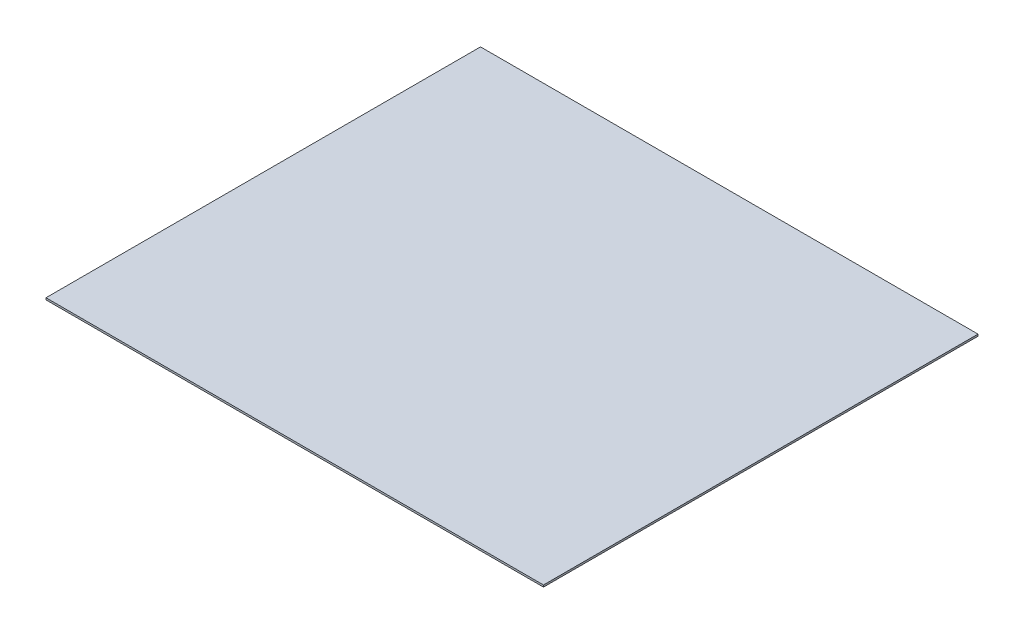
ISO-10303-21;
HEADER;
FILE_DESCRIPTION(('STEP AP214'),'2;1');
FILE_NAME('part.step','',(''),(''),'','','');
FILE_SCHEMA(('AUTOMOTIVE_DESIGN { 1 0 10303 214 1 1 1 1 }'));
ENDSEC;
DATA;
#1=APPLICATION_CONTEXT('core data for automotive mechanical design processes');
#2=APPLICATION_PROTOCOL_DEFINITION('international standard','automotive_design',2000,#1);
#3=PRODUCT_CONTEXT('',#1,'mechanical');
#4=PRODUCT('Part','Part','',(#3));
#5=PRODUCT_RELATED_PRODUCT_CATEGORY('part','',(#4));
#6=PRODUCT_DEFINITION_FORMATION('','',#4);
#7=PRODUCT_DEFINITION_CONTEXT('part definition',#1,'design');
#8=PRODUCT_DEFINITION('design','',#6,#7);
#9=PRODUCT_DEFINITION_SHAPE('','',#8);
#10=(LENGTH_UNIT() NAMED_UNIT(*) SI_UNIT(.MILLI.,.METRE.));
#11=(NAMED_UNIT(*) PLANE_ANGLE_UNIT() SI_UNIT($,.RADIAN.));
#12=(NAMED_UNIT(*) SI_UNIT($,.STERADIAN.) SOLID_ANGLE_UNIT());
#13=UNCERTAINTY_MEASURE_WITH_UNIT(LENGTH_MEASURE(1.E-05),#10,'distance_accuracy_value','');
#14=(GEOMETRIC_REPRESENTATION_CONTEXT(3) GLOBAL_UNCERTAINTY_ASSIGNED_CONTEXT((#13)) GLOBAL_UNIT_ASSIGNED_CONTEXT((#10,
#11,#12)) REPRESENTATION_CONTEXT('',''));
#15=CARTESIAN_POINT('',(0.,0.,0.));
#16=DIRECTION('',(0.,0.,1.));
#17=DIRECTION('',(1.,0.,0.));
#18=AXIS2_PLACEMENT_3D('',#15,#16,#17);
#19=CARTESIAN_POINT('',(395.,3.,345.));
#20=DIRECTION('',(-1.,0.,0.));
#21=DIRECTION('',(0.,0.,1.));
#22=AXIS2_PLACEMENT_3D('',#19,#20,#21);
#23=PLANE('',#22);
#24=DIRECTION('',(0.,0.,-1.));
#25=VECTOR('',#24,1.);
#26=CARTESIAN_POINT('',(395.,0.,345.));
#27=LINE('',#26,#25);
#28=CARTESIAN_POINT('',(395.,0.,345.));
#29=VERTEX_POINT('',#28);
#30=CARTESIAN_POINT('',(395.,0.,-345.));
#31=VERTEX_POINT('',#30);
#32=EDGE_CURVE('E95',#29,#31,#27,.T.);
#33=ORIENTED_EDGE('',*,*,#32,.T.);
#34=DIRECTION('',(0.,-1.,0.));
#35=VECTOR('',#34,1.);
#36=CARTESIAN_POINT('',(395.,3.,-345.));
#37=LINE('',#36,#35);
#38=CARTESIAN_POINT('',(395.,3.,-345.));
#39=VERTEX_POINT('',#38);
#40=EDGE_CURVE('E11',#39,#31,#37,.T.);
#41=ORIENTED_EDGE('',*,*,#40,.F.);
#42=DIRECTION('',(0.,0.,-1.));
#43=VECTOR('',#42,1.);
#44=CARTESIAN_POINT('',(395.,3.,345.));
#45=LINE('',#44,#43);
#46=CARTESIAN_POINT('',(395.,3.,345.));
#47=VERTEX_POINT('',#46);
#48=EDGE_CURVE('E83',#47,#39,#45,.T.);
#49=ORIENTED_EDGE('',*,*,#48,.F.);
#50=DIRECTION('',(0.,-1.,0.));
#51=VECTOR('',#50,1.);
#52=CARTESIAN_POINT('',(395.,3.,345.));
#53=LINE('',#52,#51);
#54=EDGE_CURVE('E91',#47,#29,#53,.T.);
#55=ORIENTED_EDGE('',*,*,#54,.T.);
#56=EDGE_LOOP('',(#33,#41,#49,#55));
#57=FACE_BOUND('',#56,.T.);
#58=ADVANCED_FACE('F32',(#57),#23,.F.);
#59=CARTESIAN_POINT('',(-395.,3.,-345.));
#60=DIRECTION('',(0.,0.,1.));
#61=DIRECTION('',(1.,0.,0.));
#62=AXIS2_PLACEMENT_3D('',#59,#60,#61);
#63=PLANE('',#62);
#64=DIRECTION('',(-1.,0.,0.));
#65=VECTOR('',#64,1.);
#66=CARTESIAN_POINT('',(-395.,0.,-345.));
#67=LINE('',#66,#65);
#68=CARTESIAN_POINT('',(-395.,0.,-345.));
#69=VERTEX_POINT('',#68);
#70=EDGE_CURVE('E87',#31,#69,#67,.T.);
#71=ORIENTED_EDGE('',*,*,#70,.T.);
#72=DIRECTION('',(0.,-1.,0.));
#73=VECTOR('',#72,1.);
#74=CARTESIAN_POINT('',(-395.,3.,-345.));
#75=LINE('',#74,#73);
#76=CARTESIAN_POINT('',(-395.,3.,-345.));
#77=VERTEX_POINT('',#76);
#78=EDGE_CURVE('E40',#77,#69,#75,.T.);
#79=ORIENTED_EDGE('',*,*,#78,.F.);
#80=DIRECTION('',(-1.,0.,0.));
#81=VECTOR('',#80,1.);
#82=CARTESIAN_POINT('',(-395.,3.,-345.));
#83=LINE('',#82,#81);
#84=EDGE_CURVE('E78',#39,#77,#83,.T.);
#85=ORIENTED_EDGE('',*,*,#84,.F.);
#86=ORIENTED_EDGE('',*,*,#40,.T.);
#87=EDGE_LOOP('',(#71,#79,#85,#86));
#88=FACE_BOUND('',#87,.T.);
#89=ADVANCED_FACE('F86',(#88),#63,.F.);
#90=CARTESIAN_POINT('',(-395.,3.,345.));
#91=DIRECTION('',(1.,0.,0.));
#92=DIRECTION('',(0.,0.,-1.));
#93=AXIS2_PLACEMENT_3D('',#90,#91,#92);
#94=PLANE('',#93);
#95=DIRECTION('',(0.,0.,1.));
#96=VECTOR('',#95,1.);
#97=CARTESIAN_POINT('',(-395.,0.,345.));
#98=LINE('',#97,#96);
#99=CARTESIAN_POINT('',(-395.,0.,345.));
#100=VERTEX_POINT('',#99);
#101=EDGE_CURVE('E65',#69,#100,#98,.T.);
#102=ORIENTED_EDGE('',*,*,#101,.T.);
#103=DIRECTION('',(0.,-1.,0.));
#104=VECTOR('',#103,1.);
#105=CARTESIAN_POINT('',(-395.,3.,345.));
#106=LINE('',#105,#104);
#107=CARTESIAN_POINT('',(-395.,3.,345.));
#108=VERTEX_POINT('',#107);
#109=EDGE_CURVE('E88',#108,#100,#106,.T.);
#110=ORIENTED_EDGE('',*,*,#109,.F.);
#111=DIRECTION('',(0.,0.,1.));
#112=VECTOR('',#111,1.);
#113=CARTESIAN_POINT('',(-395.,3.,345.));
#114=LINE('',#113,#112);
#115=EDGE_CURVE('E81',#77,#108,#114,.T.);
#116=ORIENTED_EDGE('',*,*,#115,.F.);
#117=ORIENTED_EDGE('',*,*,#78,.T.);
#118=EDGE_LOOP('',(#102,#110,#116,#117));
#119=FACE_BOUND('',#118,.T.);
#120=ADVANCED_FACE('F89',(#119),#94,.F.);
#121=CARTESIAN_POINT('',(-395.,3.,345.));
#122=DIRECTION('',(0.,0.,-1.));
#123=DIRECTION('',(-1.,0.,0.));
#124=AXIS2_PLACEMENT_3D('',#121,#122,#123);
#125=PLANE('',#124);
#126=DIRECTION('',(1.,0.,0.));
#127=VECTOR('',#126,1.);
#128=CARTESIAN_POINT('',(-395.,0.,345.));
#129=LINE('',#128,#127);
#130=EDGE_CURVE('E71',#100,#29,#129,.T.);
#131=ORIENTED_EDGE('',*,*,#130,.T.);
#132=ORIENTED_EDGE('',*,*,#54,.F.);
#133=DIRECTION('',(1.,0.,0.));
#134=VECTOR('',#133,1.);
#135=CARTESIAN_POINT('',(-395.,3.,345.));
#136=LINE('',#135,#134);
#137=EDGE_CURVE('E48',#108,#47,#136,.T.);
#138=ORIENTED_EDGE('',*,*,#137,.F.);
#139=ORIENTED_EDGE('',*,*,#109,.T.);
#140=EDGE_LOOP('',(#131,#132,#138,#139));
#141=FACE_BOUND('',#140,.T.);
#142=ADVANCED_FACE('F102',(#141),#125,.F.);
#143=CARTESIAN_POINT('',(0.,3.,0.));
#144=DIRECTION('',(0.,-1.,0.));
#145=DIRECTION('',(0.,0.,-1.));
#146=AXIS2_PLACEMENT_3D('',#143,#144,#145);
#147=PLANE('',#146);
#148=ORIENTED_EDGE('',*,*,#48,.T.);
#149=ORIENTED_EDGE('',*,*,#84,.T.);
#150=ORIENTED_EDGE('',*,*,#115,.T.);
#151=ORIENTED_EDGE('',*,*,#137,.T.);
#152=EDGE_LOOP('',(#148,#149,#150,#151));
#153=FACE_BOUND('',#152,.T.);
#154=ADVANCED_FACE('F79',(#153),#147,.F.);
#155=CARTESIAN_POINT('',(0.,0.,0.));
#156=DIRECTION('',(0.,-1.,0.));
#157=DIRECTION('',(0.,0.,-1.));
#158=AXIS2_PLACEMENT_3D('',#155,#156,#157);
#159=PLANE('',#158);
#160=ORIENTED_EDGE('',*,*,#32,.F.);
#161=ORIENTED_EDGE('',*,*,#130,.F.);
#162=ORIENTED_EDGE('',*,*,#101,.F.);
#163=ORIENTED_EDGE('',*,*,#70,.F.);
#164=EDGE_LOOP('',(#160,#161,#162,#163));
#165=FACE_BOUND('',#164,.T.);
#166=ADVANCED_FACE('F105',(#165),#159,.T.);
#167=CLOSED_SHELL('',(#58,#89,#120,#142,#154,#166));
#168=MANIFOLD_SOLID_BREP('B2',#167);
#169=ADVANCED_BREP_SHAPE_REPRESENTATION('',(#18,#168),#14);
#170=SHAPE_DEFINITION_REPRESENTATION(#9,#169);
ENDSEC;
END-ISO-10303-21;
